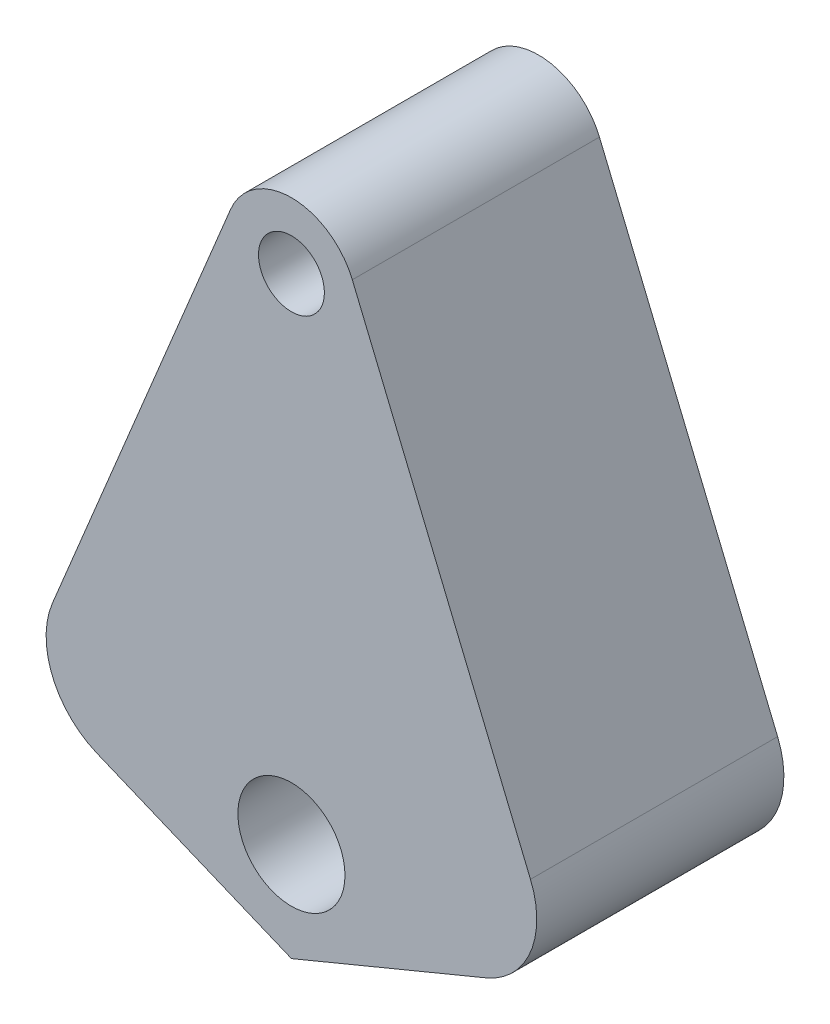
ISO-10303-21;
HEADER;
FILE_DESCRIPTION(('STEP AP214'),'2;1');
FILE_NAME('part.step','',(''),(''),'','','');
FILE_SCHEMA(('AUTOMOTIVE_DESIGN { 1 0 10303 214 1 1 1 1 }'));
ENDSEC;
DATA;
#1=APPLICATION_CONTEXT('core data for automotive mechanical design processes');
#2=APPLICATION_PROTOCOL_DEFINITION('international standard','automotive_design',2000,#1);
#3=PRODUCT_CONTEXT('',#1,'mechanical');
#4=PRODUCT('Part','Part','',(#3));
#5=PRODUCT_RELATED_PRODUCT_CATEGORY('part','',(#4));
#6=PRODUCT_DEFINITION_FORMATION('','',#4);
#7=PRODUCT_DEFINITION_CONTEXT('part definition',#1,'design');
#8=PRODUCT_DEFINITION('design','',#6,#7);
#9=PRODUCT_DEFINITION_SHAPE('','',#8);
#10=(LENGTH_UNIT() NAMED_UNIT(*) SI_UNIT(.MILLI.,.METRE.));
#11=(NAMED_UNIT(*) PLANE_ANGLE_UNIT() SI_UNIT($,.RADIAN.));
#12=(NAMED_UNIT(*) SI_UNIT($,.STERADIAN.) SOLID_ANGLE_UNIT());
#13=UNCERTAINTY_MEASURE_WITH_UNIT(LENGTH_MEASURE(1.E-05),#10,'distance_accuracy_value','');
#14=(GEOMETRIC_REPRESENTATION_CONTEXT(3) GLOBAL_UNCERTAINTY_ASSIGNED_CONTEXT((#13)) GLOBAL_UNIT_ASSIGNED_CONTEXT((#10,
#11,#12)) REPRESENTATION_CONTEXT('',''));
#15=CARTESIAN_POINT('',(0.,0.,0.));
#16=DIRECTION('',(0.,0.,1.));
#17=DIRECTION('',(1.,0.,0.));
#18=AXIS2_PLACEMENT_3D('',#15,#16,#17);
#19=CARTESIAN_POINT('',(39.5625014680846,-147.77484620071,30.));
#20=DIRECTION('',(0.,0.,-1.));
#21=DIRECTION('',(-1.,0.,0.));
#22=AXIS2_PLACEMENT_3D('',#19,#20,#21);
#23=PLANE('',#22);
#24=DIRECTION('',(0.923879532511287,-0.38268343236509,0.));
#25=VECTOR('',#24,1.);
#26=CARTESIAN_POINT('',(-47.2161701153864,-166.252436850936,30.));
#27=LINE('',#26,#25);
#28=CARTESIAN_POINT('',(-47.2161701153864,-166.252436850936,30.));
#29=VERTEX_POINT('',#28);
#30=CARTESIAN_POINT('',(0.,-185.810014876044,30.));
#31=VERTEX_POINT('',#30);
#32=EDGE_CURVE('E136',#29,#31,#27,.T.);
#33=ORIENTED_EDGE('',*,*,#32,.T.);
#34=DIRECTION('',(0.923879532511287,0.38268343236509,0.));
#35=VECTOR('',#34,1.);
#36=CARTESIAN_POINT('',(47.2161701153864,-166.252436850936,30.));
#37=LINE('',#36,#35);
#38=CARTESIAN_POINT('',(47.2161701153864,-166.252436850936,30.));
#39=VERTEX_POINT('',#38);
#40=EDGE_CURVE('E89',#31,#39,#37,.T.);
#41=ORIENTED_EDGE('',*,*,#40,.T.);
#42=CARTESIAN_POINT('',(39.5625014680846,-147.77484620071,30.));
#43=DIRECTION('',(0.,0.,1.));
#44=DIRECTION('',(-1.,0.,0.));
#45=AXIS2_PLACEMENT_3D('',#42,#43,#44);
#46=CIRCLE('',#45,20.);
#47=CARTESIAN_POINT('',(58.0400921183103,-140.121177553408,30.));
#48=VERTEX_POINT('',#47);
#49=EDGE_CURVE('E148',#39,#48,#46,.T.);
#50=ORIENTED_EDGE('',*,*,#49,.T.);
#51=DIRECTION('',(-0.382683432365091,0.923879532511286,0.));
#52=VECTOR('',#51,1.);
#53=CARTESIAN_POINT('',(14.7820725201806,-35.6870799582025,30.));
#54=LINE('',#53,#52);
#55=CARTESIAN_POINT('',(14.7820725201806,-35.6870799582025,30.));
#56=VERTEX_POINT('',#55);
#57=EDGE_CURVE('E105',#48,#56,#54,.T.);
#58=ORIENTED_EDGE('',*,*,#57,.T.);
#59=CARTESIAN_POINT('',(0.,-41.810014876044,30.));
#60=DIRECTION('',(0.,0.,1.));
#61=DIRECTION('',(1.,0.,0.));
#62=AXIS2_PLACEMENT_3D('',#59,#60,#61);
#63=CIRCLE('',#62,16.);
#64=CARTESIAN_POINT('',(-14.7820725201806,-35.6870799582025,30.));
#65=VERTEX_POINT('',#64);
#66=EDGE_CURVE('E99',#56,#65,#63,.T.);
#67=ORIENTED_EDGE('',*,*,#66,.T.);
#68=DIRECTION('',(-0.382683432365091,-0.923879532511287,0.));
#69=VECTOR('',#68,1.);
#70=CARTESIAN_POINT('',(-14.7820725201806,-35.6870799582025,30.));
#71=LINE('',#70,#69);
#72=CARTESIAN_POINT('',(-58.0400921183103,-140.121177553408,30.));
#73=VERTEX_POINT('',#72);
#74=EDGE_CURVE('E103',#65,#73,#71,.T.);
#75=ORIENTED_EDGE('',*,*,#74,.T.);
#76=CARTESIAN_POINT('',(-39.5625014680846,-147.77484620071,30.));
#77=DIRECTION('',(0.,0.,1.));
#78=DIRECTION('',(-1.,0.,0.));
#79=AXIS2_PLACEMENT_3D('',#76,#77,#78);
#80=CIRCLE('',#79,20.);
#81=EDGE_CURVE('E49',#73,#29,#80,.T.);
#82=ORIENTED_EDGE('',*,*,#81,.T.);
#83=EDGE_LOOP('',(#33,#41,#50,#58,#67,#75,#82));
#84=FACE_BOUND('',#83,.T.);
#85=CARTESIAN_POINT('',(0.,-41.810014876044,30.));
#86=DIRECTION('',(0.,0.,1.));
#87=DIRECTION('',(1.,0.,0.));
#88=AXIS2_PLACEMENT_3D('',#85,#86,#87);
#89=CIRCLE('',#88,8.);
#90=CARTESIAN_POINT('',(8.00000000000001,-41.810014876044,30.));
#91=VERTEX_POINT('',#90);
#92=EDGE_CURVE('E127',#91,#91,#89,.T.);
#93=ORIENTED_EDGE('',*,*,#92,.F.);
#94=EDGE_LOOP('',(#93));
#95=FACE_BOUND('',#94,.T.);
#96=CARTESIAN_POINT('',(0.,-161.810014876044,30.));
#97=DIRECTION('',(0.,0.,1.));
#98=DIRECTION('',(1.,0.,0.));
#99=AXIS2_PLACEMENT_3D('',#96,#97,#98);
#100=CIRCLE('',#99,13.);
#101=CARTESIAN_POINT('',(13.,-161.810014876044,30.));
#102=VERTEX_POINT('',#101);
#103=EDGE_CURVE('E163',#102,#102,#100,.T.);
#104=ORIENTED_EDGE('',*,*,#103,.F.);
#105=EDGE_LOOP('',(#104));
#106=FACE_BOUND('',#105,.T.);
#107=ADVANCED_FACE('F32',(#84,#95,#106),#23,.F.);
#108=CARTESIAN_POINT('',(39.5625014680846,-147.77484620071,-30.));
#109=DIRECTION('',(0.,0.,-1.));
#110=DIRECTION('',(-1.,0.,0.));
#111=AXIS2_PLACEMENT_3D('',#108,#109,#110);
#112=PLANE('',#111);
#113=CARTESIAN_POINT('',(0.,-41.810014876044,-30.));
#114=DIRECTION('',(0.,0.,1.));
#115=DIRECTION('',(1.,0.,0.));
#116=AXIS2_PLACEMENT_3D('',#113,#114,#115);
#117=CIRCLE('',#116,8.);
#118=CARTESIAN_POINT('',(8.00000000000001,-41.810014876044,-30.));
#119=VERTEX_POINT('',#118);
#120=EDGE_CURVE('E160',#119,#119,#117,.T.);
#121=ORIENTED_EDGE('',*,*,#120,.T.);
#122=EDGE_LOOP('',(#121));
#123=FACE_BOUND('',#122,.T.);
#124=DIRECTION('',(0.923879532511287,-0.38268343236509,0.));
#125=VECTOR('',#124,1.);
#126=CARTESIAN_POINT('',(-47.2161701153864,-166.252436850936,-30.));
#127=LINE('',#126,#125);
#128=CARTESIAN_POINT('',(-47.2161701153864,-166.252436850936,-30.));
#129=VERTEX_POINT('',#128);
#130=CARTESIAN_POINT('',(0.,-185.810014876044,-30.));
#131=VERTEX_POINT('',#130);
#132=EDGE_CURVE('E123',#129,#131,#127,.T.);
#133=ORIENTED_EDGE('',*,*,#132,.F.);
#134=CARTESIAN_POINT('',(-39.5625014680846,-147.77484620071,-30.));
#135=DIRECTION('',(0.,0.,1.));
#136=DIRECTION('',(-1.,0.,0.));
#137=AXIS2_PLACEMENT_3D('',#134,#135,#136);
#138=CIRCLE('',#137,20.);
#139=CARTESIAN_POINT('',(-58.0400921183103,-140.121177553408,-30.));
#140=VERTEX_POINT('',#139);
#141=EDGE_CURVE('E81',#140,#129,#138,.T.);
#142=ORIENTED_EDGE('',*,*,#141,.F.);
#143=DIRECTION('',(-0.382683432365091,-0.923879532511287,0.));
#144=VECTOR('',#143,1.);
#145=CARTESIAN_POINT('',(-14.7820725201806,-35.6870799582025,-30.));
#146=LINE('',#145,#144);
#147=CARTESIAN_POINT('',(-14.7820725201806,-35.6870799582025,-30.));
#148=VERTEX_POINT('',#147);
#149=EDGE_CURVE('E75',#148,#140,#146,.T.);
#150=ORIENTED_EDGE('',*,*,#149,.F.);
#151=CARTESIAN_POINT('',(0.,-41.810014876044,-30.));
#152=DIRECTION('',(0.,0.,1.));
#153=DIRECTION('',(1.,0.,0.));
#154=AXIS2_PLACEMENT_3D('',#151,#152,#153);
#155=CIRCLE('',#154,16.);
#156=CARTESIAN_POINT('',(14.7820725201806,-35.6870799582025,-30.));
#157=VERTEX_POINT('',#156);
#158=EDGE_CURVE('E113',#157,#148,#155,.T.);
#159=ORIENTED_EDGE('',*,*,#158,.F.);
#160=DIRECTION('',(-0.382683432365091,0.923879532511286,0.));
#161=VECTOR('',#160,1.);
#162=CARTESIAN_POINT('',(14.7820725201806,-35.6870799582025,-30.));
#163=LINE('',#162,#161);
#164=CARTESIAN_POINT('',(58.0400921183103,-140.121177553408,-30.));
#165=VERTEX_POINT('',#164);
#166=EDGE_CURVE('E131',#165,#157,#163,.T.);
#167=ORIENTED_EDGE('',*,*,#166,.F.);
#168=CARTESIAN_POINT('',(39.5625014680846,-147.77484620071,-30.));
#169=DIRECTION('',(0.,0.,1.));
#170=DIRECTION('',(-1.,0.,0.));
#171=AXIS2_PLACEMENT_3D('',#168,#169,#170);
#172=CIRCLE('',#171,20.);
#173=CARTESIAN_POINT('',(47.2161701153864,-166.252436850936,-30.));
#174=VERTEX_POINT('',#173);
#175=EDGE_CURVE('E129',#174,#165,#172,.T.);
#176=ORIENTED_EDGE('',*,*,#175,.F.);
#177=DIRECTION('',(0.923879532511287,0.38268343236509,0.));
#178=VECTOR('',#177,1.);
#179=CARTESIAN_POINT('',(47.2161701153864,-166.252436850936,-30.));
#180=LINE('',#179,#178);
#181=EDGE_CURVE('E126',#131,#174,#180,.T.);
#182=ORIENTED_EDGE('',*,*,#181,.F.);
#183=EDGE_LOOP('',(#133,#142,#150,#159,#167,#176,#182));
#184=FACE_BOUND('',#183,.T.);
#185=CARTESIAN_POINT('',(0.,-161.810014876044,-30.));
#186=DIRECTION('',(0.,0.,1.));
#187=DIRECTION('',(1.,0.,0.));
#188=AXIS2_PLACEMENT_3D('',#185,#186,#187);
#189=CIRCLE('',#188,13.);
#190=CARTESIAN_POINT('',(13.,-161.810014876044,-30.));
#191=VERTEX_POINT('',#190);
#192=EDGE_CURVE('E166',#191,#191,#189,.T.);
#193=ORIENTED_EDGE('',*,*,#192,.T.);
#194=EDGE_LOOP('',(#193));
#195=FACE_BOUND('',#194,.T.);
#196=ADVANCED_FACE('F152',(#123,#184,#195),#112,.T.);
#197=CARTESIAN_POINT('',(-47.2161701153864,-166.252436850936,30.));
#198=DIRECTION('',(0.38268343236509,0.923879532511287,0.));
#199=DIRECTION('',(-0.923879532511287,0.38268343236509,0.));
#200=AXIS2_PLACEMENT_3D('',#197,#198,#199);
#201=PLANE('',#200);
#202=ORIENTED_EDGE('',*,*,#132,.T.);
#203=DIRECTION('',(0.,0.,-1.));
#204=VECTOR('',#203,1.);
#205=CARTESIAN_POINT('',(0.,-185.810014876044,30.));
#206=LINE('',#205,#204);
#207=EDGE_CURVE('E11',#31,#131,#206,.T.);
#208=ORIENTED_EDGE('',*,*,#207,.F.);
#209=ORIENTED_EDGE('',*,*,#32,.F.);
#210=DIRECTION('',(0.,0.,-1.));
#211=VECTOR('',#210,1.);
#212=CARTESIAN_POINT('',(-47.2161701153864,-166.252436850936,30.));
#213=LINE('',#212,#211);
#214=EDGE_CURVE('E119',#29,#129,#213,.T.);
#215=ORIENTED_EDGE('',*,*,#214,.T.);
#216=EDGE_LOOP('',(#202,#208,#209,#215));
#217=FACE_BOUND('',#216,.T.);
#218=ADVANCED_FACE('F34',(#217),#201,.F.);
#219=CARTESIAN_POINT('',(47.2161701153864,-166.252436850936,30.));
#220=DIRECTION('',(-0.38268343236509,0.923879532511287,0.));
#221=DIRECTION('',(-0.923879532511287,-0.38268343236509,0.));
#222=AXIS2_PLACEMENT_3D('',#219,#220,#221);
#223=PLANE('',#222);
#224=ORIENTED_EDGE('',*,*,#181,.T.);
#225=DIRECTION('',(0.,0.,-1.));
#226=VECTOR('',#225,1.);
#227=CARTESIAN_POINT('',(47.2161701153864,-166.252436850936,30.));
#228=LINE('',#227,#226);
#229=EDGE_CURVE('E41',#39,#174,#228,.T.);
#230=ORIENTED_EDGE('',*,*,#229,.F.);
#231=ORIENTED_EDGE('',*,*,#40,.F.);
#232=ORIENTED_EDGE('',*,*,#207,.T.);
#233=EDGE_LOOP('',(#224,#230,#231,#232));
#234=FACE_BOUND('',#233,.T.);
#235=ADVANCED_FACE('F196',(#234),#223,.F.);
#236=CARTESIAN_POINT('',(39.5625014680846,-147.77484620071,30.));
#237=DIRECTION('',(0.,0.,-1.));
#238=DIRECTION('',(-1.,0.,0.));
#239=AXIS2_PLACEMENT_3D('',#236,#237,#238);
#240=CYLINDRICAL_SURFACE('',#239,20.);
#241=ORIENTED_EDGE('',*,*,#175,.T.);
#242=DIRECTION('',(0.,0.,-1.));
#243=VECTOR('',#242,1.);
#244=CARTESIAN_POINT('',(58.0400921183103,-140.121177553408,30.));
#245=LINE('',#244,#243);
#246=EDGE_CURVE('E140',#48,#165,#245,.T.);
#247=ORIENTED_EDGE('',*,*,#246,.F.);
#248=ORIENTED_EDGE('',*,*,#49,.F.);
#249=ORIENTED_EDGE('',*,*,#229,.T.);
#250=EDGE_LOOP('',(#241,#247,#248,#249));
#251=FACE_BOUND('',#250,.T.);
#252=ADVANCED_FACE('F146',(#251),#240,.T.);
#253=CARTESIAN_POINT('',(14.7820725201806,-35.6870799582025,30.));
#254=DIRECTION('',(-0.923879532511286,-0.382683432365091,0.));
#255=DIRECTION('',(0.382683432365091,-0.923879532511286,0.));
#256=AXIS2_PLACEMENT_3D('',#253,#254,#255);
#257=PLANE('',#256);
#258=ORIENTED_EDGE('',*,*,#166,.T.);
#259=DIRECTION('',(0.,0.,-1.));
#260=VECTOR('',#259,1.);
#261=CARTESIAN_POINT('',(14.7820725201806,-35.6870799582025,30.));
#262=LINE('',#261,#260);
#263=EDGE_CURVE('E114',#56,#157,#262,.T.);
#264=ORIENTED_EDGE('',*,*,#263,.F.);
#265=ORIENTED_EDGE('',*,*,#57,.F.);
#266=ORIENTED_EDGE('',*,*,#246,.T.);
#267=EDGE_LOOP('',(#258,#264,#265,#266));
#268=FACE_BOUND('',#267,.T.);
#269=ADVANCED_FACE('F155',(#268),#257,.F.);
#270=CARTESIAN_POINT('',(0.,-41.810014876044,30.));
#271=DIRECTION('',(0.,0.,-1.));
#272=DIRECTION('',(-1.,0.,0.));
#273=AXIS2_PLACEMENT_3D('',#270,#271,#272);
#274=CYLINDRICAL_SURFACE('',#273,16.);
#275=ORIENTED_EDGE('',*,*,#158,.T.);
#276=DIRECTION('',(0.,0.,-1.));
#277=VECTOR('',#276,1.);
#278=CARTESIAN_POINT('',(-14.7820725201806,-35.6870799582025,30.));
#279=LINE('',#278,#277);
#280=EDGE_CURVE('E110',#65,#148,#279,.T.);
#281=ORIENTED_EDGE('',*,*,#280,.F.);
#282=ORIENTED_EDGE('',*,*,#66,.F.);
#283=ORIENTED_EDGE('',*,*,#263,.T.);
#284=EDGE_LOOP('',(#275,#281,#282,#283));
#285=FACE_BOUND('',#284,.T.);
#286=ADVANCED_FACE('F111',(#285),#274,.T.);
#287=CARTESIAN_POINT('',(-14.7820725201806,-35.6870799582025,30.));
#288=DIRECTION('',(0.923879532511286,-0.38268343236509,0.));
#289=DIRECTION('',(0.382683432365091,0.923879532511287,0.));
#290=AXIS2_PLACEMENT_3D('',#287,#288,#289);
#291=PLANE('',#290);
#292=ORIENTED_EDGE('',*,*,#149,.T.);
#293=DIRECTION('',(0.,0.,-1.));
#294=VECTOR('',#293,1.);
#295=CARTESIAN_POINT('',(-58.0400921183103,-140.121177553408,30.));
#296=LINE('',#295,#294);
#297=EDGE_CURVE('E115',#73,#140,#296,.T.);
#298=ORIENTED_EDGE('',*,*,#297,.F.);
#299=ORIENTED_EDGE('',*,*,#74,.F.);
#300=ORIENTED_EDGE('',*,*,#280,.T.);
#301=EDGE_LOOP('',(#292,#298,#299,#300));
#302=FACE_BOUND('',#301,.T.);
#303=ADVANCED_FACE('F117',(#302),#291,.F.);
#304=CARTESIAN_POINT('',(-39.5625014680846,-147.77484620071,30.));
#305=DIRECTION('',(0.,0.,-1.));
#306=DIRECTION('',(-1.,0.,0.));
#307=AXIS2_PLACEMENT_3D('',#304,#305,#306);
#308=CYLINDRICAL_SURFACE('',#307,20.);
#309=ORIENTED_EDGE('',*,*,#141,.T.);
#310=ORIENTED_EDGE('',*,*,#214,.F.);
#311=ORIENTED_EDGE('',*,*,#81,.F.);
#312=ORIENTED_EDGE('',*,*,#297,.T.);
#313=EDGE_LOOP('',(#309,#310,#311,#312));
#314=FACE_BOUND('',#313,.T.);
#315=ADVANCED_FACE('F186',(#314),#308,.T.);
#316=CARTESIAN_POINT('',(0.,-41.810014876044,30.));
#317=DIRECTION('',(0.,0.,-1.));
#318=DIRECTION('',(-1.,0.,0.));
#319=AXIS2_PLACEMENT_3D('',#316,#317,#318);
#320=CYLINDRICAL_SURFACE('',#319,8.);
#321=ORIENTED_EDGE('',*,*,#92,.T.);
#322=EDGE_LOOP('',(#321));
#323=FACE_BOUND('',#322,.T.);
#324=ORIENTED_EDGE('',*,*,#120,.F.);
#325=EDGE_LOOP('',(#324));
#326=FACE_BOUND('',#325,.T.);
#327=ADVANCED_FACE('F183',(#323,#326),#320,.F.);
#328=CARTESIAN_POINT('',(0.,-161.810014876044,30.));
#329=DIRECTION('',(0.,0.,-1.));
#330=DIRECTION('',(-1.,0.,0.));
#331=AXIS2_PLACEMENT_3D('',#328,#329,#330);
#332=CYLINDRICAL_SURFACE('',#331,13.);
#333=ORIENTED_EDGE('',*,*,#103,.T.);
#334=EDGE_LOOP('',(#333));
#335=FACE_BOUND('',#334,.T.);
#336=ORIENTED_EDGE('',*,*,#192,.F.);
#337=EDGE_LOOP('',(#336));
#338=FACE_BOUND('',#337,.T.);
#339=ADVANCED_FACE('F172',(#335,#338),#332,.F.);
#340=CLOSED_SHELL('',(#107,#196,#218,#235,#252,#269,#286,#303,#315,#327,#339));
#341=MANIFOLD_SOLID_BREP('B2',#340);
#342=ADVANCED_BREP_SHAPE_REPRESENTATION('',(#18,#341),#14);
#343=SHAPE_DEFINITION_REPRESENTATION(#9,#342);
ENDSEC;
END-ISO-10303-21;
